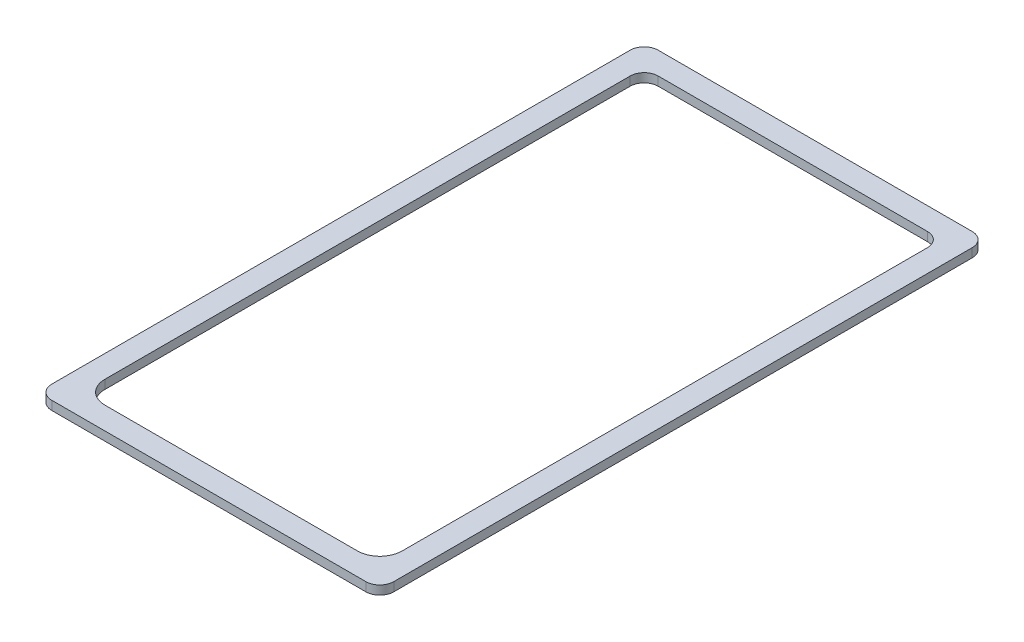
ISO-10303-21;
HEADER;
FILE_DESCRIPTION(('STEP AP214'),'2;1');
FILE_NAME('part.step','',(''),(''),'','','');
FILE_SCHEMA(('AUTOMOTIVE_DESIGN { 1 0 10303 214 1 1 1 1 }'));
ENDSEC;
DATA;
#1=APPLICATION_CONTEXT('core data for automotive mechanical design processes');
#2=APPLICATION_PROTOCOL_DEFINITION('international standard','automotive_design',2000,#1);
#3=PRODUCT_CONTEXT('',#1,'mechanical');
#4=PRODUCT('Part','Part','',(#3));
#5=PRODUCT_RELATED_PRODUCT_CATEGORY('part','',(#4));
#6=PRODUCT_DEFINITION_FORMATION('','',#4);
#7=PRODUCT_DEFINITION_CONTEXT('part definition',#1,'design');
#8=PRODUCT_DEFINITION('design','',#6,#7);
#9=PRODUCT_DEFINITION_SHAPE('','',#8);
#10=(LENGTH_UNIT() NAMED_UNIT(*) SI_UNIT(.MILLI.,.METRE.));
#11=(NAMED_UNIT(*) PLANE_ANGLE_UNIT() SI_UNIT($,.RADIAN.));
#12=(NAMED_UNIT(*) SI_UNIT($,.STERADIAN.) SOLID_ANGLE_UNIT());
#13=UNCERTAINTY_MEASURE_WITH_UNIT(LENGTH_MEASURE(1.E-05),#10,'distance_accuracy_value','');
#14=(GEOMETRIC_REPRESENTATION_CONTEXT(3) GLOBAL_UNCERTAINTY_ASSIGNED_CONTEXT((#13)) GLOBAL_UNIT_ASSIGNED_CONTEXT((#10,
#11,#12)) REPRESENTATION_CONTEXT('',''));
#15=CARTESIAN_POINT('',(0.,0.,0.));
#16=DIRECTION('',(0.,0.,1.));
#17=DIRECTION('',(1.,0.,0.));
#18=AXIS2_PLACEMENT_3D('',#15,#16,#17);
#19=CARTESIAN_POINT('',(28.1,1.5875,51.75));
#20=DIRECTION('',(0.,1.,0.));
#21=DIRECTION('',(0.,0.,1.));
#22=AXIS2_PLACEMENT_3D('',#19,#20,#21);
#23=PLANE('',#22);
#24=CARTESIAN_POINT('',(28.1,1.5875,51.75));
#25=DIRECTION('',(0.,1.,0.));
#26=DIRECTION('',(0.,0.,1.));
#27=AXIS2_PLACEMENT_3D('',#24,#25,#26);
#28=CIRCLE('',#27,2.5);
#29=CARTESIAN_POINT('',(28.1,1.5875,54.25));
#30=VERTEX_POINT('',#29);
#31=CARTESIAN_POINT('',(30.6,1.5875,51.75));
#32=VERTEX_POINT('',#31);
#33=EDGE_CURVE('E252',#30,#32,#28,.T.);
#34=ORIENTED_EDGE('',*,*,#33,.T.);
#35=DIRECTION('',(0.,0.,-1.));
#36=VECTOR('',#35,1.);
#37=CARTESIAN_POINT('',(30.6,1.5875,51.75));
#38=LINE('',#37,#36);
#39=CARTESIAN_POINT('',(30.6,1.5875,-51.75));
#40=VERTEX_POINT('',#39);
#41=EDGE_CURVE('E256',#32,#40,#38,.T.);
#42=ORIENTED_EDGE('',*,*,#41,.T.);
#43=CARTESIAN_POINT('',(28.1,1.5875,-51.75));
#44=DIRECTION('',(0.,1.,0.));
#45=DIRECTION('',(0.,0.,1.));
#46=AXIS2_PLACEMENT_3D('',#43,#44,#45);
#47=CIRCLE('',#46,2.5);
#48=CARTESIAN_POINT('',(28.1,1.5875,-54.25));
#49=VERTEX_POINT('',#48);
#50=EDGE_CURVE('E260',#40,#49,#47,.T.);
#51=ORIENTED_EDGE('',*,*,#50,.T.);
#52=DIRECTION('',(-1.,0.,0.));
#53=VECTOR('',#52,1.);
#54=CARTESIAN_POINT('',(28.1,1.5875,-54.25));
#55=LINE('',#54,#53);
#56=CARTESIAN_POINT('',(-28.1,1.5875,-54.25));
#57=VERTEX_POINT('',#56);
#58=EDGE_CURVE('E262',#49,#57,#55,.T.);
#59=ORIENTED_EDGE('',*,*,#58,.T.);
#60=CARTESIAN_POINT('',(-28.1,1.5875,-51.75));
#61=DIRECTION('',(0.,1.,0.));
#62=DIRECTION('',(0.,0.,1.));
#63=AXIS2_PLACEMENT_3D('',#60,#61,#62);
#64=CIRCLE('',#63,2.5);
#65=CARTESIAN_POINT('',(-30.6,1.5875,-51.75));
#66=VERTEX_POINT('',#65);
#67=EDGE_CURVE('E264',#57,#66,#64,.T.);
#68=ORIENTED_EDGE('',*,*,#67,.T.);
#69=DIRECTION('',(0.,0.,1.));
#70=VECTOR('',#69,1.);
#71=CARTESIAN_POINT('',(-30.6,1.5875,51.75));
#72=LINE('',#71,#70);
#73=CARTESIAN_POINT('',(-30.6,1.5875,51.75));
#74=VERTEX_POINT('',#73);
#75=EDGE_CURVE('E267',#66,#74,#72,.T.);
#76=ORIENTED_EDGE('',*,*,#75,.T.);
#77=CARTESIAN_POINT('',(-28.1,1.5875,51.75));
#78=DIRECTION('',(0.,1.,0.));
#79=DIRECTION('',(0.,0.,-1.));
#80=AXIS2_PLACEMENT_3D('',#77,#78,#79);
#81=CIRCLE('',#80,2.5);
#82=CARTESIAN_POINT('',(-28.1,1.5875,54.25));
#83=VERTEX_POINT('',#82);
#84=EDGE_CURVE('E270',#74,#83,#81,.T.);
#85=ORIENTED_EDGE('',*,*,#84,.T.);
#86=DIRECTION('',(1.,0.,0.));
#87=VECTOR('',#86,1.);
#88=CARTESIAN_POINT('',(28.1,1.5875,54.25));
#89=LINE('',#88,#87);
#90=EDGE_CURVE('E273',#83,#30,#89,.T.);
#91=ORIENTED_EDGE('',*,*,#90,.T.);
#92=EDGE_LOOP('',(#34,#42,#51,#59,#68,#76,#85,#91));
#93=FACE_BOUND('',#92,.T.);
#94=DIRECTION('',(-1.,0.,0.));
#95=VECTOR('',#94,1.);
#96=CARTESIAN_POINT('',(24.1,1.5875,-50.25));
#97=LINE('',#96,#95);
#98=CARTESIAN_POINT('',(24.1,1.5875,-50.25));
#99=VERTEX_POINT('',#98);
#100=CARTESIAN_POINT('',(-24.1,1.5875,-50.25));
#101=VERTEX_POINT('',#100);
#102=EDGE_CURVE('E181',#99,#101,#97,.T.);
#103=ORIENTED_EDGE('',*,*,#102,.F.);
#104=CARTESIAN_POINT('',(24.1,1.5875,-47.75));
#105=DIRECTION('',(0.,1.,0.));
#106=DIRECTION('',(0.,0.,1.));
#107=AXIS2_PLACEMENT_3D('',#104,#105,#106);
#108=CIRCLE('',#107,2.5);
#109=CARTESIAN_POINT('',(26.6,1.5875,-47.75));
#110=VERTEX_POINT('',#109);
#111=EDGE_CURVE('E173',#110,#99,#108,.T.);
#112=ORIENTED_EDGE('',*,*,#111,.F.);
#113=DIRECTION('',(0.,0.,-1.));
#114=VECTOR('',#113,1.);
#115=CARTESIAN_POINT('',(26.6,1.5875,46.25));
#116=LINE('',#115,#114);
#117=CARTESIAN_POINT('',(26.6,1.5875,46.25));
#118=VERTEX_POINT('',#117);
#119=EDGE_CURVE('E210',#118,#110,#116,.T.);
#120=ORIENTED_EDGE('',*,*,#119,.F.);
#121=CARTESIAN_POINT('',(22.6,1.5875,46.25));
#122=DIRECTION('',(0.,1.,0.));
#123=DIRECTION('',(0.,0.,1.));
#124=AXIS2_PLACEMENT_3D('',#121,#122,#123);
#125=CIRCLE('',#124,4.);
#126=CARTESIAN_POINT('',(22.6,1.5875,50.25));
#127=VERTEX_POINT('',#126);
#128=EDGE_CURVE('E207',#127,#118,#125,.T.);
#129=ORIENTED_EDGE('',*,*,#128,.F.);
#130=DIRECTION('',(1.,0.,0.));
#131=VECTOR('',#130,1.);
#132=CARTESIAN_POINT('',(22.6,1.5875,50.25));
#133=LINE('',#132,#131);
#134=CARTESIAN_POINT('',(-22.6,1.5875,50.25));
#135=VERTEX_POINT('',#134);
#136=EDGE_CURVE('E204',#135,#127,#133,.T.);
#137=ORIENTED_EDGE('',*,*,#136,.F.);
#138=CARTESIAN_POINT('',(-22.6,1.5875,46.25));
#139=DIRECTION('',(0.,1.,0.));
#140=DIRECTION('',(0.,0.,-1.));
#141=AXIS2_PLACEMENT_3D('',#138,#139,#140);
#142=CIRCLE('',#141,4.);
#143=CARTESIAN_POINT('',(-26.6,1.5875,46.25));
#144=VERTEX_POINT('',#143);
#145=EDGE_CURVE('E201',#144,#135,#142,.T.);
#146=ORIENTED_EDGE('',*,*,#145,.F.);
#147=DIRECTION('',(0.,0.,1.));
#148=VECTOR('',#147,1.);
#149=CARTESIAN_POINT('',(-26.6,1.5875,46.25));
#150=LINE('',#149,#148);
#151=CARTESIAN_POINT('',(-26.6,1.5875,-47.75));
#152=VERTEX_POINT('',#151);
#153=EDGE_CURVE('E196',#152,#144,#150,.T.);
#154=ORIENTED_EDGE('',*,*,#153,.F.);
#155=CARTESIAN_POINT('',(-24.1,1.5875,-47.75));
#156=DIRECTION('',(0.,1.,0.));
#157=DIRECTION('',(0.,0.,1.));
#158=AXIS2_PLACEMENT_3D('',#155,#156,#157);
#159=CIRCLE('',#158,2.5);
#160=EDGE_CURVE('E194',#101,#152,#159,.T.);
#161=ORIENTED_EDGE('',*,*,#160,.F.);
#162=EDGE_LOOP('',(#103,#112,#120,#129,#137,#146,#154,#161));
#163=FACE_BOUND('',#162,.T.);
#164=ADVANCED_FACE('F41',(#93,#163),#23,.T.);
#165=CARTESIAN_POINT('',(28.1,0.,51.75));
#166=DIRECTION('',(0.,1.,0.));
#167=DIRECTION('',(0.,0.,1.));
#168=AXIS2_PLACEMENT_3D('',#165,#166,#167);
#169=PLANE('',#168);
#170=CARTESIAN_POINT('',(28.1,0.,51.75));
#171=DIRECTION('',(0.,1.,0.));
#172=DIRECTION('',(0.,0.,1.));
#173=AXIS2_PLACEMENT_3D('',#170,#171,#172);
#174=CIRCLE('',#173,2.5);
#175=CARTESIAN_POINT('',(28.1,0.,54.25));
#176=VERTEX_POINT('',#175);
#177=CARTESIAN_POINT('',(30.6,0.,51.75));
#178=VERTEX_POINT('',#177);
#179=EDGE_CURVE('E189',#176,#178,#174,.T.);
#180=ORIENTED_EDGE('',*,*,#179,.F.);
#181=DIRECTION('',(1.,0.,0.));
#182=VECTOR('',#181,1.);
#183=CARTESIAN_POINT('',(28.1,0.,54.25));
#184=LINE('',#183,#182);
#185=CARTESIAN_POINT('',(-28.1,0.,54.25));
#186=VERTEX_POINT('',#185);
#187=EDGE_CURVE('E257',#186,#176,#184,.T.);
#188=ORIENTED_EDGE('',*,*,#187,.F.);
#189=CARTESIAN_POINT('',(-28.1,0.,51.75));
#190=DIRECTION('',(0.,1.,0.));
#191=DIRECTION('',(0.,0.,-1.));
#192=AXIS2_PLACEMENT_3D('',#189,#190,#191);
#193=CIRCLE('',#192,2.5);
#194=CARTESIAN_POINT('',(-30.6,0.,51.75));
#195=VERTEX_POINT('',#194);
#196=EDGE_CURVE('E293',#195,#186,#193,.T.);
#197=ORIENTED_EDGE('',*,*,#196,.F.);
#198=DIRECTION('',(0.,0.,1.));
#199=VECTOR('',#198,1.);
#200=CARTESIAN_POINT('',(-30.6,0.,51.75));
#201=LINE('',#200,#199);
#202=CARTESIAN_POINT('',(-30.6,0.,-51.75));
#203=VERTEX_POINT('',#202);
#204=EDGE_CURVE('E290',#203,#195,#201,.T.);
#205=ORIENTED_EDGE('',*,*,#204,.F.);
#206=CARTESIAN_POINT('',(-28.1,0.,-51.75));
#207=DIRECTION('',(0.,1.,0.));
#208=DIRECTION('',(0.,0.,1.));
#209=AXIS2_PLACEMENT_3D('',#206,#207,#208);
#210=CIRCLE('',#209,2.5);
#211=CARTESIAN_POINT('',(-28.1,0.,-54.25));
#212=VERTEX_POINT('',#211);
#213=EDGE_CURVE('E287',#212,#203,#210,.T.);
#214=ORIENTED_EDGE('',*,*,#213,.F.);
#215=DIRECTION('',(-1.,0.,0.));
#216=VECTOR('',#215,1.);
#217=CARTESIAN_POINT('',(28.1,0.,-54.25));
#218=LINE('',#217,#216);
#219=CARTESIAN_POINT('',(28.1,0.,-54.25));
#220=VERTEX_POINT('',#219);
#221=EDGE_CURVE('E285',#220,#212,#218,.T.);
#222=ORIENTED_EDGE('',*,*,#221,.F.);
#223=CARTESIAN_POINT('',(28.1,0.,-51.75));
#224=DIRECTION('',(0.,1.,0.));
#225=DIRECTION('',(0.,0.,1.));
#226=AXIS2_PLACEMENT_3D('',#223,#224,#225);
#227=CIRCLE('',#226,2.5);
#228=CARTESIAN_POINT('',(30.6,0.,-51.75));
#229=VERTEX_POINT('',#228);
#230=EDGE_CURVE('E283',#229,#220,#227,.T.);
#231=ORIENTED_EDGE('',*,*,#230,.F.);
#232=DIRECTION('',(0.,0.,-1.));
#233=VECTOR('',#232,1.);
#234=CARTESIAN_POINT('',(30.6,0.,51.75));
#235=LINE('',#234,#233);
#236=EDGE_CURVE('E280',#178,#229,#235,.T.);
#237=ORIENTED_EDGE('',*,*,#236,.F.);
#238=EDGE_LOOP('',(#180,#188,#197,#205,#214,#222,#231,#237));
#239=FACE_BOUND('',#238,.T.);
#240=CARTESIAN_POINT('',(24.1,0.,-47.75));
#241=DIRECTION('',(0.,1.,0.));
#242=DIRECTION('',(0.,0.,1.));
#243=AXIS2_PLACEMENT_3D('',#240,#241,#242);
#244=CIRCLE('',#243,2.5);
#245=CARTESIAN_POINT('',(26.6,0.,-47.75));
#246=VERTEX_POINT('',#245);
#247=CARTESIAN_POINT('',(24.1,0.,-50.25));
#248=VERTEX_POINT('',#247);
#249=EDGE_CURVE('E67',#246,#248,#244,.T.);
#250=ORIENTED_EDGE('',*,*,#249,.T.);
#251=DIRECTION('',(-1.,0.,0.));
#252=VECTOR('',#251,1.);
#253=CARTESIAN_POINT('',(24.1,0.,-50.25));
#254=LINE('',#253,#252);
#255=CARTESIAN_POINT('',(-24.1,0.,-50.25));
#256=VERTEX_POINT('',#255);
#257=EDGE_CURVE('E188',#248,#256,#254,.T.);
#258=ORIENTED_EDGE('',*,*,#257,.T.);
#259=CARTESIAN_POINT('',(-24.1,0.,-47.75));
#260=DIRECTION('',(0.,1.,0.));
#261=DIRECTION('',(0.,0.,1.));
#262=AXIS2_PLACEMENT_3D('',#259,#260,#261);
#263=CIRCLE('',#262,2.5);
#264=CARTESIAN_POINT('',(-26.6,0.,-47.75));
#265=VERTEX_POINT('',#264);
#266=EDGE_CURVE('E215',#256,#265,#263,.T.);
#267=ORIENTED_EDGE('',*,*,#266,.T.);
#268=DIRECTION('',(0.,0.,1.));
#269=VECTOR('',#268,1.);
#270=CARTESIAN_POINT('',(-26.6,0.,46.25));
#271=LINE('',#270,#269);
#272=CARTESIAN_POINT('',(-26.6,0.,46.25));
#273=VERTEX_POINT('',#272);
#274=EDGE_CURVE('E218',#265,#273,#271,.T.);
#275=ORIENTED_EDGE('',*,*,#274,.T.);
#276=CARTESIAN_POINT('',(-22.6,0.,46.25));
#277=DIRECTION('',(0.,1.,0.));
#278=DIRECTION('',(0.,0.,-1.));
#279=AXIS2_PLACEMENT_3D('',#276,#277,#278);
#280=CIRCLE('',#279,4.);
#281=CARTESIAN_POINT('',(-22.6,0.,50.25));
#282=VERTEX_POINT('',#281);
#283=EDGE_CURVE('E222',#273,#282,#280,.T.);
#284=ORIENTED_EDGE('',*,*,#283,.T.);
#285=DIRECTION('',(1.,0.,0.));
#286=VECTOR('',#285,1.);
#287=CARTESIAN_POINT('',(22.6,0.,50.25));
#288=LINE('',#287,#286);
#289=CARTESIAN_POINT('',(22.6,0.,50.25));
#290=VERTEX_POINT('',#289);
#291=EDGE_CURVE('E226',#282,#290,#288,.T.);
#292=ORIENTED_EDGE('',*,*,#291,.T.);
#293=CARTESIAN_POINT('',(22.6,0.,46.25));
#294=DIRECTION('',(0.,1.,0.));
#295=DIRECTION('',(0.,0.,1.));
#296=AXIS2_PLACEMENT_3D('',#293,#294,#295);
#297=CIRCLE('',#296,4.);
#298=CARTESIAN_POINT('',(26.6,0.,46.25));
#299=VERTEX_POINT('',#298);
#300=EDGE_CURVE('E230',#290,#299,#297,.T.);
#301=ORIENTED_EDGE('',*,*,#300,.T.);
#302=DIRECTION('',(0.,0.,-1.));
#303=VECTOR('',#302,1.);
#304=CARTESIAN_POINT('',(26.6,0.,46.25));
#305=LINE('',#304,#303);
#306=EDGE_CURVE('E182',#299,#246,#305,.T.);
#307=ORIENTED_EDGE('',*,*,#306,.T.);
#308=EDGE_LOOP('',(#250,#258,#267,#275,#284,#292,#301,#307));
#309=FACE_BOUND('',#308,.T.);
#310=ADVANCED_FACE('F329',(#239,#309),#169,.F.);
#311=CARTESIAN_POINT('',(28.1,1.5875,51.75));
#312=DIRECTION('',(0.,-1.,0.));
#313=DIRECTION('',(0.,0.,-1.));
#314=AXIS2_PLACEMENT_3D('',#311,#312,#313);
#315=CYLINDRICAL_SURFACE('',#314,2.5);
#316=ORIENTED_EDGE('',*,*,#179,.T.);
#317=DIRECTION('',(0.,-1.,0.));
#318=VECTOR('',#317,1.);
#319=CARTESIAN_POINT('',(30.6,1.5875,51.75));
#320=LINE('',#319,#318);
#321=EDGE_CURVE('E11',#32,#178,#320,.T.);
#322=ORIENTED_EDGE('',*,*,#321,.F.);
#323=ORIENTED_EDGE('',*,*,#33,.F.);
#324=DIRECTION('',(0.,-1.,0.));
#325=VECTOR('',#324,1.);
#326=CARTESIAN_POINT('',(28.1,1.5875,54.25));
#327=LINE('',#326,#325);
#328=EDGE_CURVE('E276',#30,#176,#327,.T.);
#329=ORIENTED_EDGE('',*,*,#328,.T.);
#330=EDGE_LOOP('',(#316,#322,#323,#329));
#331=FACE_BOUND('',#330,.T.);
#332=ADVANCED_FACE('F43',(#331),#315,.T.);
#333=CARTESIAN_POINT('',(30.6,1.5875,51.75));
#334=DIRECTION('',(-1.,0.,0.));
#335=DIRECTION('',(0.,0.,1.));
#336=AXIS2_PLACEMENT_3D('',#333,#334,#335);
#337=PLANE('',#336);
#338=ORIENTED_EDGE('',*,*,#236,.T.);
#339=DIRECTION('',(0.,-1.,0.));
#340=VECTOR('',#339,1.);
#341=CARTESIAN_POINT('',(30.6,1.5875,-51.75));
#342=LINE('',#341,#340);
#343=EDGE_CURVE('E50',#40,#229,#342,.T.);
#344=ORIENTED_EDGE('',*,*,#343,.F.);
#345=ORIENTED_EDGE('',*,*,#41,.F.);
#346=ORIENTED_EDGE('',*,*,#321,.T.);
#347=EDGE_LOOP('',(#338,#344,#345,#346));
#348=FACE_BOUND('',#347,.T.);
#349=ADVANCED_FACE('F346',(#348),#337,.F.);
#350=CARTESIAN_POINT('',(28.1,1.5875,-51.75));
#351=DIRECTION('',(0.,-1.,0.));
#352=DIRECTION('',(0.,0.,-1.));
#353=AXIS2_PLACEMENT_3D('',#350,#351,#352);
#354=CYLINDRICAL_SURFACE('',#353,2.5);
#355=ORIENTED_EDGE('',*,*,#230,.T.);
#356=DIRECTION('',(0.,-1.,0.));
#357=VECTOR('',#356,1.);
#358=CARTESIAN_POINT('',(28.1,1.5875,-54.25));
#359=LINE('',#358,#357);
#360=EDGE_CURVE('E316',#49,#220,#359,.T.);
#361=ORIENTED_EDGE('',*,*,#360,.F.);
#362=ORIENTED_EDGE('',*,*,#50,.F.);
#363=ORIENTED_EDGE('',*,*,#343,.T.);
#364=EDGE_LOOP('',(#355,#361,#362,#363));
#365=FACE_BOUND('',#364,.T.);
#366=ADVANCED_FACE('F323',(#365),#354,.T.);
#367=CARTESIAN_POINT('',(28.1,1.5875,-54.25));
#368=DIRECTION('',(0.,0.,1.));
#369=DIRECTION('',(1.,0.,0.));
#370=AXIS2_PLACEMENT_3D('',#367,#368,#369);
#371=PLANE('',#370);
#372=ORIENTED_EDGE('',*,*,#221,.T.);
#373=DIRECTION('',(0.,-1.,0.));
#374=VECTOR('',#373,1.);
#375=CARTESIAN_POINT('',(-28.1,1.5875,-54.25));
#376=LINE('',#375,#374);
#377=EDGE_CURVE('E313',#57,#212,#376,.T.);
#378=ORIENTED_EDGE('',*,*,#377,.F.);
#379=ORIENTED_EDGE('',*,*,#58,.F.);
#380=ORIENTED_EDGE('',*,*,#360,.T.);
#381=EDGE_LOOP('',(#372,#378,#379,#380));
#382=FACE_BOUND('',#381,.T.);
#383=ADVANCED_FACE('F335',(#382),#371,.F.);
#384=CARTESIAN_POINT('',(-28.1,1.5875,-51.75));
#385=DIRECTION('',(0.,-1.,0.));
#386=DIRECTION('',(0.,0.,-1.));
#387=AXIS2_PLACEMENT_3D('',#384,#385,#386);
#388=CYLINDRICAL_SURFACE('',#387,2.5);
#389=ORIENTED_EDGE('',*,*,#213,.T.);
#390=DIRECTION('',(0.,-1.,0.));
#391=VECTOR('',#390,1.);
#392=CARTESIAN_POINT('',(-30.6,1.5875,-51.75));
#393=LINE('',#392,#391);
#394=EDGE_CURVE('E309',#66,#203,#393,.T.);
#395=ORIENTED_EDGE('',*,*,#394,.F.);
#396=ORIENTED_EDGE('',*,*,#67,.F.);
#397=ORIENTED_EDGE('',*,*,#377,.T.);
#398=EDGE_LOOP('',(#389,#395,#396,#397));
#399=FACE_BOUND('',#398,.T.);
#400=ADVANCED_FACE('F339',(#399),#388,.T.);
#401=CARTESIAN_POINT('',(-30.6,1.5875,51.75));
#402=DIRECTION('',(1.,0.,0.));
#403=DIRECTION('',(0.,0.,-1.));
#404=AXIS2_PLACEMENT_3D('',#401,#402,#403);
#405=PLANE('',#404);
#406=ORIENTED_EDGE('',*,*,#204,.T.);
#407=DIRECTION('',(0.,-1.,0.));
#408=VECTOR('',#407,1.);
#409=CARTESIAN_POINT('',(-30.6,1.5875,51.75));
#410=LINE('',#409,#408);
#411=EDGE_CURVE('E305',#74,#195,#410,.T.);
#412=ORIENTED_EDGE('',*,*,#411,.F.);
#413=ORIENTED_EDGE('',*,*,#75,.F.);
#414=ORIENTED_EDGE('',*,*,#394,.T.);
#415=EDGE_LOOP('',(#406,#412,#413,#414));
#416=FACE_BOUND('',#415,.T.);
#417=ADVANCED_FACE('F359',(#416),#405,.F.);
#418=CARTESIAN_POINT('',(-28.1,1.5875,51.75));
#419=DIRECTION('',(0.,-1.,0.));
#420=DIRECTION('',(0.,0.,-1.));
#421=AXIS2_PLACEMENT_3D('',#418,#419,#420);
#422=CYLINDRICAL_SURFACE('',#421,2.5);
#423=ORIENTED_EDGE('',*,*,#196,.T.);
#424=DIRECTION('',(0.,-1.,0.));
#425=VECTOR('',#424,1.);
#426=CARTESIAN_POINT('',(-28.1,1.5875,54.25));
#427=LINE('',#426,#425);
#428=EDGE_CURVE('E301',#83,#186,#427,.T.);
#429=ORIENTED_EDGE('',*,*,#428,.F.);
#430=ORIENTED_EDGE('',*,*,#84,.F.);
#431=ORIENTED_EDGE('',*,*,#411,.T.);
#432=EDGE_LOOP('',(#423,#429,#430,#431));
#433=FACE_BOUND('',#432,.T.);
#434=ADVANCED_FACE('F357',(#433),#422,.T.);
#435=CARTESIAN_POINT('',(28.1,1.5875,54.25));
#436=DIRECTION('',(0.,0.,-1.));
#437=DIRECTION('',(-1.,0.,0.));
#438=AXIS2_PLACEMENT_3D('',#435,#436,#437);
#439=PLANE('',#438);
#440=ORIENTED_EDGE('',*,*,#187,.T.);
#441=ORIENTED_EDGE('',*,*,#328,.F.);
#442=ORIENTED_EDGE('',*,*,#90,.F.);
#443=ORIENTED_EDGE('',*,*,#428,.T.);
#444=EDGE_LOOP('',(#440,#441,#442,#443));
#445=FACE_BOUND('',#444,.T.);
#446=ADVANCED_FACE('F352',(#445),#439,.F.);
#447=CARTESIAN_POINT('',(24.1,1.5875,-47.75));
#448=DIRECTION('',(0.,-1.,0.));
#449=DIRECTION('',(0.,0.,-1.));
#450=AXIS2_PLACEMENT_3D('',#447,#448,#449);
#451=CYLINDRICAL_SURFACE('',#450,2.5);
#452=ORIENTED_EDGE('',*,*,#249,.F.);
#453=DIRECTION('',(0.,-1.,0.));
#454=VECTOR('',#453,1.);
#455=CARTESIAN_POINT('',(26.6,1.5875,-47.75));
#456=LINE('',#455,#454);
#457=EDGE_CURVE('E177',#110,#246,#456,.T.);
#458=ORIENTED_EDGE('',*,*,#457,.F.);
#459=ORIENTED_EDGE('',*,*,#111,.T.);
#460=DIRECTION('',(0.,-1.,0.));
#461=VECTOR('',#460,1.);
#462=CARTESIAN_POINT('',(24.1,1.5875,-50.25));
#463=LINE('',#462,#461);
#464=EDGE_CURVE('E176',#99,#248,#463,.T.);
#465=ORIENTED_EDGE('',*,*,#464,.T.);
#466=EDGE_LOOP('',(#452,#458,#459,#465));
#467=FACE_BOUND('',#466,.T.);
#468=ADVANCED_FACE('F175',(#467),#451,.F.);
#469=CARTESIAN_POINT('',(24.1,1.5875,-50.25));
#470=DIRECTION('',(0.,0.,1.));
#471=DIRECTION('',(1.,0.,0.));
#472=AXIS2_PLACEMENT_3D('',#469,#470,#471);
#473=PLANE('',#472);
#474=ORIENTED_EDGE('',*,*,#257,.F.);
#475=ORIENTED_EDGE('',*,*,#464,.F.);
#476=ORIENTED_EDGE('',*,*,#102,.T.);
#477=DIRECTION('',(0.,-1.,0.));
#478=VECTOR('',#477,1.);
#479=CARTESIAN_POINT('',(-24.1,1.5875,-50.25));
#480=LINE('',#479,#478);
#481=EDGE_CURVE('E190',#101,#256,#480,.T.);
#482=ORIENTED_EDGE('',*,*,#481,.T.);
#483=EDGE_LOOP('',(#474,#475,#476,#482));
#484=FACE_BOUND('',#483,.T.);
#485=ADVANCED_FACE('F185',(#484),#473,.T.);
#486=CARTESIAN_POINT('',(-24.1,1.5875,-47.75));
#487=DIRECTION('',(0.,-1.,0.));
#488=DIRECTION('',(0.,0.,-1.));
#489=AXIS2_PLACEMENT_3D('',#486,#487,#488);
#490=CYLINDRICAL_SURFACE('',#489,2.5);
#491=ORIENTED_EDGE('',*,*,#266,.F.);
#492=ORIENTED_EDGE('',*,*,#481,.F.);
#493=ORIENTED_EDGE('',*,*,#160,.T.);
#494=DIRECTION('',(0.,-1.,0.));
#495=VECTOR('',#494,1.);
#496=CARTESIAN_POINT('',(-26.6,1.5875,-47.75));
#497=LINE('',#496,#495);
#498=EDGE_CURVE('E249',#152,#265,#497,.T.);
#499=ORIENTED_EDGE('',*,*,#498,.T.);
#500=EDGE_LOOP('',(#491,#492,#493,#499));
#501=FACE_BOUND('',#500,.T.);
#502=ADVANCED_FACE('F384',(#501),#490,.F.);
#503=CARTESIAN_POINT('',(-26.6,1.5875,46.25));
#504=DIRECTION('',(1.,0.,0.));
#505=DIRECTION('',(0.,0.,-1.));
#506=AXIS2_PLACEMENT_3D('',#503,#504,#505);
#507=PLANE('',#506);
#508=ORIENTED_EDGE('',*,*,#274,.F.);
#509=ORIENTED_EDGE('',*,*,#498,.F.);
#510=ORIENTED_EDGE('',*,*,#153,.T.);
#511=DIRECTION('',(0.,-1.,0.));
#512=VECTOR('',#511,1.);
#513=CARTESIAN_POINT('',(-26.6,1.5875,46.25));
#514=LINE('',#513,#512);
#515=EDGE_CURVE('E246',#144,#273,#514,.T.);
#516=ORIENTED_EDGE('',*,*,#515,.T.);
#517=EDGE_LOOP('',(#508,#509,#510,#516));
#518=FACE_BOUND('',#517,.T.);
#519=ADVANCED_FACE('F388',(#518),#507,.T.);
#520=CARTESIAN_POINT('',(-22.6,1.5875,46.25));
#521=DIRECTION('',(0.,-1.,0.));
#522=DIRECTION('',(0.,0.,-1.));
#523=AXIS2_PLACEMENT_3D('',#520,#521,#522);
#524=CYLINDRICAL_SURFACE('',#523,4.);
#525=ORIENTED_EDGE('',*,*,#283,.F.);
#526=ORIENTED_EDGE('',*,*,#515,.F.);
#527=ORIENTED_EDGE('',*,*,#145,.T.);
#528=DIRECTION('',(0.,-1.,0.));
#529=VECTOR('',#528,1.);
#530=CARTESIAN_POINT('',(-22.6,1.5875,50.25));
#531=LINE('',#530,#529);
#532=EDGE_CURVE('E243',#135,#282,#531,.T.);
#533=ORIENTED_EDGE('',*,*,#532,.T.);
#534=EDGE_LOOP('',(#525,#526,#527,#533));
#535=FACE_BOUND('',#534,.T.);
#536=ADVANCED_FACE('F394',(#535),#524,.F.);
#537=CARTESIAN_POINT('',(22.6,1.5875,50.25));
#538=DIRECTION('',(0.,0.,-1.));
#539=DIRECTION('',(-1.,0.,0.));
#540=AXIS2_PLACEMENT_3D('',#537,#538,#539);
#541=PLANE('',#540);
#542=ORIENTED_EDGE('',*,*,#291,.F.);
#543=ORIENTED_EDGE('',*,*,#532,.F.);
#544=ORIENTED_EDGE('',*,*,#136,.T.);
#545=DIRECTION('',(0.,-1.,0.));
#546=VECTOR('',#545,1.);
#547=CARTESIAN_POINT('',(22.6,1.5875,50.25));
#548=LINE('',#547,#546);
#549=EDGE_CURVE('E240',#127,#290,#548,.T.);
#550=ORIENTED_EDGE('',*,*,#549,.T.);
#551=EDGE_LOOP('',(#542,#543,#544,#550));
#552=FACE_BOUND('',#551,.T.);
#553=ADVANCED_FACE('F398',(#552),#541,.T.);
#554=CARTESIAN_POINT('',(22.6,1.5875,46.25));
#555=DIRECTION('',(0.,-1.,0.));
#556=DIRECTION('',(0.,0.,-1.));
#557=AXIS2_PLACEMENT_3D('',#554,#555,#556);
#558=CYLINDRICAL_SURFACE('',#557,4.);
#559=ORIENTED_EDGE('',*,*,#300,.F.);
#560=ORIENTED_EDGE('',*,*,#549,.F.);
#561=ORIENTED_EDGE('',*,*,#128,.T.);
#562=DIRECTION('',(0.,-1.,0.));
#563=VECTOR('',#562,1.);
#564=CARTESIAN_POINT('',(26.6,1.5875,46.25));
#565=LINE('',#564,#563);
#566=EDGE_CURVE('E59',#118,#299,#565,.T.);
#567=ORIENTED_EDGE('',*,*,#566,.T.);
#568=EDGE_LOOP('',(#559,#560,#561,#567));
#569=FACE_BOUND('',#568,.T.);
#570=ADVANCED_FACE('F402',(#569),#558,.F.);
#571=CARTESIAN_POINT('',(26.6,1.5875,46.25));
#572=DIRECTION('',(-1.,0.,0.));
#573=DIRECTION('',(0.,0.,1.));
#574=AXIS2_PLACEMENT_3D('',#571,#572,#573);
#575=PLANE('',#574);
#576=ORIENTED_EDGE('',*,*,#306,.F.);
#577=ORIENTED_EDGE('',*,*,#566,.F.);
#578=ORIENTED_EDGE('',*,*,#119,.T.);
#579=ORIENTED_EDGE('',*,*,#457,.T.);
#580=EDGE_LOOP('',(#576,#577,#578,#579));
#581=FACE_BOUND('',#580,.T.);
#582=ADVANCED_FACE('F406',(#581),#575,.T.);
#583=CLOSED_SHELL('',(#164,#310,#332,#349,#366,#383,#400,#417,#434,#446,#468,#485,#502,#519,
#536,#553,#570,#582));
#584=MANIFOLD_SOLID_BREP('B2',#583);
#585=ADVANCED_BREP_SHAPE_REPRESENTATION('',(#18,#584),#14);
#586=SHAPE_DEFINITION_REPRESENTATION(#9,#585);
ENDSEC;
END-ISO-10303-21;
